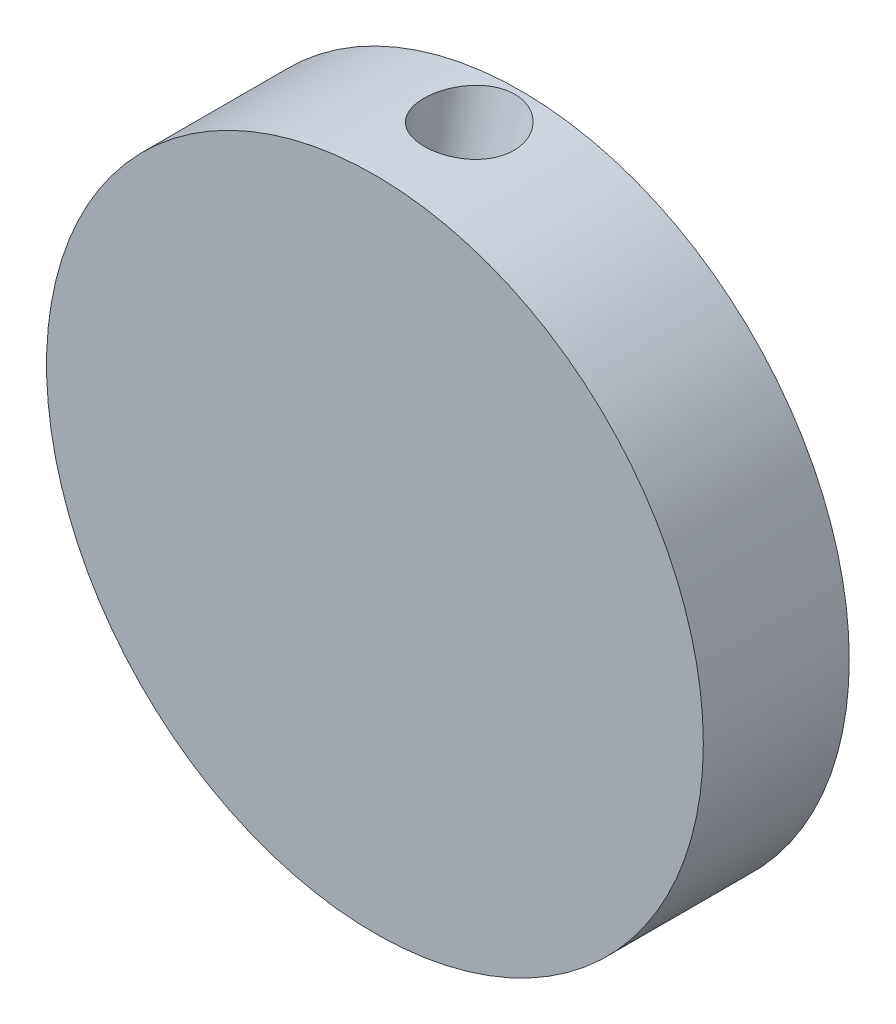
ISO-10303-21;
HEADER;
FILE_DESCRIPTION(('STEP AP214'),'2;1');
FILE_NAME('part.step','',(''),(''),'','','');
FILE_SCHEMA(('AUTOMOTIVE_DESIGN { 1 0 10303 214 1 1 1 1 }'));
ENDSEC;
DATA;
#1=APPLICATION_CONTEXT('core data for automotive mechanical design processes');
#2=APPLICATION_PROTOCOL_DEFINITION('international standard','automotive_design',2000,#1);
#3=PRODUCT_CONTEXT('',#1,'mechanical');
#4=PRODUCT('Part','Part','',(#3));
#5=PRODUCT_RELATED_PRODUCT_CATEGORY('part','',(#4));
#6=PRODUCT_DEFINITION_FORMATION('','',#4);
#7=PRODUCT_DEFINITION_CONTEXT('part definition',#1,'design');
#8=PRODUCT_DEFINITION('design','',#6,#7);
#9=PRODUCT_DEFINITION_SHAPE('','',#8);
#10=(LENGTH_UNIT() NAMED_UNIT(*) SI_UNIT(.MILLI.,.METRE.));
#11=(NAMED_UNIT(*) PLANE_ANGLE_UNIT() SI_UNIT($,.RADIAN.));
#12=(NAMED_UNIT(*) SI_UNIT($,.STERADIAN.) SOLID_ANGLE_UNIT());
#13=UNCERTAINTY_MEASURE_WITH_UNIT(LENGTH_MEASURE(1.E-05),#10,'distance_accuracy_value','');
#14=(GEOMETRIC_REPRESENTATION_CONTEXT(3) GLOBAL_UNCERTAINTY_ASSIGNED_CONTEXT((#13)) GLOBAL_UNIT_ASSIGNED_CONTEXT((#10,
#11,#12)) REPRESENTATION_CONTEXT('',''));
#15=CARTESIAN_POINT('',(0.,0.,0.));
#16=DIRECTION('',(0.,0.,1.));
#17=DIRECTION('',(1.,0.,0.));
#18=AXIS2_PLACEMENT_3D('',#15,#16,#17);
#19=CARTESIAN_POINT('',(0.,0.,10.));
#20=DIRECTION('',(0.,0.,-1.));
#21=DIRECTION('',(-1.,0.,0.));
#22=AXIS2_PLACEMENT_3D('',#19,#20,#21);
#23=CYLINDRICAL_SURFACE('',#22,22.5);
#24=CARTESIAN_POINT('',(0.,22.5,0.416088975917614));
#25=CARTESIAN_POINT('',(0.0841173534757251,22.4999998236408,0.416069373883097));
#26=CARTESIAN_POINT('',(0.168250403935408,22.4995269574923,0.419576395565012));
#27=CARTESIAN_POINT('',(0.335892927208812,22.4976489483546,0.433747976487415));
#28=CARTESIAN_POINT('',(0.41940239608743,22.4962437994874,0.444412580857198));
#29=CARTESIAN_POINT('',(0.585263971612885,22.4925397525901,0.472708884604191));
#30=CARTESIAN_POINT('',(0.667615425723561,22.4902403700504,0.49034436099223));
#31=CARTESIAN_POINT('',(0.830581807909579,22.4848127714845,0.532391950800592));
#32=CARTESIAN_POINT('',(0.911195312437828,22.481683901984,0.556809407827975));
#33=CARTESIAN_POINT('',(1.14916261741757,22.471192123422,0.639971683350821));
#34=CARTESIAN_POINT('',(1.30314417083689,22.4627120874331,0.708712052339517));
#35=CARTESIAN_POINT('',(1.52395528332059,22.4484536469346,0.829660770069476));
#36=CARTESIAN_POINT('',(1.59590955614474,22.4434406200461,0.872984514710498));
#37=CARTESIAN_POINT('',(1.7360224807668,22.433036836622,0.965338480811951));
#38=CARTESIAN_POINT('',(1.80418270484854,22.427646238678,1.01436631202975));
#39=CARTESIAN_POINT('',(1.93817059273906,22.4164703819955,1.11914849402003));
#40=CARTESIAN_POINT('',(2.00388081772991,22.4106783190496,1.17505189691424));
#41=CARTESIAN_POINT('',(2.13042663785238,22.3990025754371,1.29200082982599));
#42=CARTESIAN_POINT('',(2.19126690501274,22.3931189892077,1.35304131333654));
#43=CARTESIAN_POINT('',(2.30782451876798,22.3814069868085,1.47990090905115));
#44=CARTESIAN_POINT('',(2.36353888965143,22.375578604425,1.54572275777642));
#45=CARTESIAN_POINT('',(2.46944373986877,22.3641384141694,1.68171226044359));
#46=CARTESIAN_POINT('',(2.51963287150526,22.3585266593522,1.75188096816284));
#47=CARTESIAN_POINT('',(2.61578294788,22.347485318574,1.89851832602634));
#48=CARTESIAN_POINT('',(2.66154272965127,22.3420683682515,1.97511993584274));
#49=CARTESIAN_POINT('',(2.74651389151972,22.3317821887278,2.13190844041299));
#50=CARTESIAN_POINT('',(2.78572504883223,22.3269129781626,2.21209545702504));
#51=CARTESIAN_POINT('',(2.85740890384119,22.317851991614,2.37547088661675));
#52=CARTESIAN_POINT('',(2.88988121847792,22.3136602541436,2.45865946990077));
#53=CARTESIAN_POINT('',(2.94768165063293,22.3060983708093,2.62752346510672));
#54=CARTESIAN_POINT('',(2.97300996551459,22.3027282022486,2.71319880825617));
#55=CARTESIAN_POINT('',(3.01632042907481,22.2969121712319,2.88669308312712));
#56=CARTESIAN_POINT('',(3.03427977787933,22.2944691792206,2.97451779000094));
#57=CARTESIAN_POINT('',(3.06283189960551,22.290564511382,3.15138001031185));
#58=CARTESIAN_POINT('',(3.07342448458031,22.2891028605913,3.24041755463275));
#59=CARTESIAN_POINT('',(3.08690915830405,22.2872394016679,3.41908831134402));
#60=CARTESIAN_POINT('',(3.08980177248981,22.2868375212176,3.50872148267105));
#61=CARTESIAN_POINT('',(3.08771156595304,22.2871271773976,3.68789015432109));
#62=CARTESIAN_POINT('',(3.08272898180906,22.2878186811815,3.77742565749729));
#63=CARTESIAN_POINT('',(3.06529783318462,22.2902226210104,3.95346889260691));
#64=CARTESIAN_POINT('',(3.05304073549612,22.2919088685474,4.03999603493683));
#65=CARTESIAN_POINT('',(3.02119640677341,22.2962469930656,4.21166883956521));
#66=CARTESIAN_POINT('',(3.00160930401738,22.2988988531482,4.29681452601253));
#67=CARTESIAN_POINT('',(2.95519686657107,22.3050971603117,4.46506475175706));
#68=CARTESIAN_POINT('',(2.92837254421778,22.3086434822714,4.54816957475629));
#69=CARTESIAN_POINT('',(2.86762773591547,22.3165330524241,4.71170427229007));
#70=CARTESIAN_POINT('',(2.83370734191158,22.3208762902912,4.79213418146831));
#71=CARTESIAN_POINT('',(2.7599469305696,22.330115106485,4.94784170470627));
#72=CARTESIAN_POINT('',(2.72026781092576,22.3349949986375,5.02319652370994));
#73=CARTESIAN_POINT('',(2.63468295117825,22.3452523410879,5.17024694335402));
#74=CARTESIAN_POINT('',(2.58877707926776,22.3506298019174,5.24194246649087));
#75=CARTESIAN_POINT('',(2.49109077906407,22.3617280265248,5.38119257457418));
#76=CARTESIAN_POINT('',(2.43931051445542,22.3674487807351,5.44874727482013));
#77=CARTESIAN_POINT('',(2.33023344566767,22.3790756699144,5.57918537117096));
#78=CARTESIAN_POINT('',(2.27293659642817,22.3849818063975,5.64206872911208));
#79=CARTESIAN_POINT('',(2.09380758365651,22.4026843938392,5.82278225763448));
#80=CARTESIAN_POINT('',(1.96431935470521,22.4145144872273,5.9332679711586));
#81=CARTESIAN_POINT('',(1.75782133417142,22.431336723951,6.08154490047223));
#82=CARTESIAN_POINT('',(1.68690919907636,22.4367925989176,6.12807919192254));
#83=CARTESIAN_POINT('',(1.54146992359311,22.4472532107022,6.21522443600208));
#84=CARTESIAN_POINT('',(1.46694273124088,22.4522579410324,6.25583530345239));
#85=CARTESIAN_POINT('',(1.31348732134309,22.4617622586879,6.33147023432567));
#86=CARTESIAN_POINT('',(1.23450567197887,22.4662517567526,6.36638701336955));
#87=CARTESIAN_POINT('',(1.07386271713154,22.4745029696648,6.42949707474147));
#88=CARTESIAN_POINT('',(0.992201357747526,22.4782646698625,6.45769022173285));
#89=CARTESIAN_POINT('',(0.826819041889698,22.4849554637773,6.50733914853247));
#90=CARTESIAN_POINT('',(0.743097935278166,22.4878844966035,6.52879443563078));
#91=CARTESIAN_POINT('',(0.574151812911303,22.4928319616868,6.56476767131367));
#92=CARTESIAN_POINT('',(0.488926859350612,22.4948504315108,6.5792859061001));
#93=CARTESIAN_POINT('',(0.316368385468406,22.4979434465125,6.60138400625009));
#94=CARTESIAN_POINT('',(0.229022004019927,22.4990045532807,6.60886515278025));
#95=CARTESIAN_POINT('',(0.0540040978437779,22.5001053959806,6.61665864243248));
#96=CARTESIAN_POINT('',(-0.0336674330588507,22.5001451124146,6.61697084870374));
#97=CARTESIAN_POINT('',(-0.208740475835562,22.4992019762441,6.61032674931561));
#98=CARTESIAN_POINT('',(-0.296141965701673,22.4982190423907,6.60336986613128));
#99=CARTESIAN_POINT('',(-0.470038824138699,22.4952578959089,6.58218026674731));
#100=CARTESIAN_POINT('',(-0.556534190496044,22.4932796808497,6.56794753277772));
#101=CARTESIAN_POINT('',(-0.728762297301127,22.4883611677718,6.53227077015143));
#102=CARTESIAN_POINT('',(-0.814482385726923,22.4854128681135,6.51076672256258));
#103=CARTESIAN_POINT('',(-0.983766689305472,22.4786427793053,6.4605942211266));
#104=CARTESIAN_POINT('',(-1.0673308924832,22.4748209853048,6.43192572749347));
#105=CARTESIAN_POINT('',(-1.23168970234693,22.4664129131196,6.36760729877411));
#106=CARTESIAN_POINT('',(-1.31248439092114,22.4618266575619,6.33195757031662));
#107=CARTESIAN_POINT('',(-1.47071750514357,22.4520218438236,6.25397686618965));
#108=CARTESIAN_POINT('',(-1.54815597980006,22.44680329488,6.21164598812193));
#109=CARTESIAN_POINT('',(-1.77321117302197,22.4305179758848,6.07567653577459));
#110=CARTESIAN_POINT('',(-1.91513104088719,22.4187371923983,5.97244966429247));
#111=CARTESIAN_POINT('',(-2.17915334328485,22.3946183545539,5.74322595050253));
#112=CARTESIAN_POINT('',(-2.30125811522429,22.3822803661442,5.61723179755545));
#113=CARTESIAN_POINT('',(-2.46555572835282,22.3645703341945,5.41517158454977));
#114=CARTESIAN_POINT('',(-2.51679388231389,22.3588485119741,5.34632569819791));
#115=CARTESIAN_POINT('',(-2.61322646184651,22.3477828895114,5.20446495767289));
#116=CARTESIAN_POINT('',(-2.65842065581954,22.3424391037587,5.13144994389581));
#117=CARTESIAN_POINT('',(-2.74240816405337,22.3322858318228,4.98180972603694));
#118=CARTESIAN_POINT('',(-2.7812021044486,22.3274762933893,4.90518487604807));
#119=CARTESIAN_POINT('',(-2.85221213582995,22.3185161807145,4.74891338908314));
#120=CARTESIAN_POINT('',(-2.88442871552541,22.3143655575197,4.66926697713623));
#121=CARTESIAN_POINT('',(-2.94159454780236,22.3069012668873,4.50844272640947));
#122=CARTESIAN_POINT('',(-2.96662629016332,22.3035781626352,4.42729469198846));
#123=CARTESIAN_POINT('',(-3.00972032736484,22.2978038911474,4.26313694242918));
#124=CARTESIAN_POINT('',(-3.02778212224171,22.2953527864624,4.18012709419225));
#125=CARTESIAN_POINT('',(-3.05708115698222,22.2913541885694,4.01289659952157));
#126=CARTESIAN_POINT('',(-3.06831854593214,22.2898066756215,3.92867597957955));
#127=CARTESIAN_POINT('',(-3.08383398874399,22.2876654284574,3.75958555916594));
#128=CARTESIAN_POINT('',(-3.08811257100269,22.2870716218243,3.67471580847592));
#129=CARTESIAN_POINT('',(-3.08959001068035,22.2868668491116,3.50454816765402));
#130=CARTESIAN_POINT('',(-3.08675815368726,22.2872601469474,3.41925001398752));
#131=CARTESIAN_POINT('',(-3.07417340669441,22.2889994797851,3.24913832992056));
#132=CARTESIAN_POINT('',(-3.06441707901525,22.2903459880109,3.16432506133416));
#133=CARTESIAN_POINT('',(-3.0381106080252,22.2939467151706,2.99576830164804));
#134=CARTESIAN_POINT('',(-3.0215596863503,22.2962010380999,2.91202493424599));
#135=CARTESIAN_POINT('',(-2.9817800629462,22.3015557648756,2.74620809318466));
#136=CARTESIAN_POINT('',(-2.95855437589648,22.3046557867274,2.66413388352392));
#137=CARTESIAN_POINT('',(-2.90479457319437,22.3117216964853,2.49971424134471));
#138=CARTESIAN_POINT('',(-2.87406194124668,22.3157107894971,2.41743467003772));
#139=CARTESIAN_POINT('',(-2.80594263267294,22.3243782341673,2.25573614346534));
#140=CARTESIAN_POINT('',(-2.76855721679517,22.3290564552022,2.17631664961838));
#141=CARTESIAN_POINT('',(-2.68742574237098,22.3389662228043,2.02086107061753));
#142=CARTESIAN_POINT('',(-2.64368147447855,22.344197613486,1.94482404080776));
#143=CARTESIAN_POINT('',(-2.55007166123947,22.3550745099624,1.79654068350962));
#144=CARTESIAN_POINT('',(-2.50020002507321,22.3607204255295,1.72429823144312));
#145=CARTESIAN_POINT('',(-2.39350336904607,22.3723955897867,1.58263521757837));
#146=CARTESIAN_POINT('',(-2.33654880683995,22.3784305590968,1.5133125955912));
#147=CARTESIAN_POINT('',(-2.21696535502326,22.3905934282628,1.37975654522362));
#148=CARTESIAN_POINT('',(-2.15433637381882,22.3967213296175,1.31552319902336));
#149=CARTESIAN_POINT('',(-2.02385222230338,22.4088892571791,1.19257300846775));
#150=CARTESIAN_POINT('',(-1.95599642730393,22.4149292727794,1.13385682536965));
#151=CARTESIAN_POINT('',(-1.81547143967112,22.426748105933,1.02254170575987));
#152=CARTESIAN_POINT('',(-1.74280455708729,22.432527046631,0.969939866396271));
#153=CARTESIAN_POINT('',(-1.59383284637395,22.4436008103483,0.871618141602209));
#154=CARTESIAN_POINT('',(-1.51756574368421,22.4488994526268,0.825841666512843));
#155=CARTESIAN_POINT('',(-1.36144678643634,22.4589092981881,0.741061093240638));
#156=CARTESIAN_POINT('',(-1.28159822254519,22.4636210262798,0.702050932299319));
#157=CARTESIAN_POINT('',(-1.03738842662419,22.4766583539306,0.595851231527724));
#158=CARTESIAN_POINT('',(-0.868088224085892,22.4839073557224,0.539310073103923));
#159=CARTESIAN_POINT('',(-0.638544317417481,22.4910105822034,0.484427474420961));
#160=CARTESIAN_POINT('',(-0.581281019831593,22.4925642575797,0.472480920227587));
#161=CARTESIAN_POINT('',(-0.466134157530776,22.4952443293755,0.451994287708021));
#162=CARTESIAN_POINT('',(-0.408250779927864,22.4963708511528,0.44345320993013));
#163=CARTESIAN_POINT('',(-0.292082201896861,22.4981791934304,0.429789234112326));
#164=CARTESIAN_POINT('',(-0.233797013435646,22.4988610271172,0.424666234714505));
#165=CARTESIAN_POINT('',(-0.117010451141467,22.4997715534771,0.417822459300576));
#166=CARTESIAN_POINT('',(-0.0585090227465544,22.5000001226692,0.416102610391786));
#167=CARTESIAN_POINT('',(0.,22.5,0.416088975917614));
#168=B_SPLINE_CURVE_WITH_KNOTS('',3,(#24,#25,#26,#27,#28,#29,#30,#31,#32,#33,#34,#35,#36,#37,
#38,#39,#40,#41,#42,#43,#44,#45,#46,#47,#48,#49,#50,#51,#52,#53,#54,#55,#56,#57,#58,#59,#60,#61,
#62,#63,#64,#65,#66,#67,#68,#69,#70,#71,#72,#73,#74,#75,#76,#77,#78,#79,#80,#81,#82,#83,#84,#85,
#86,#87,#88,#89,#90,#91,#92,#93,#94,#95,#96,#97,#98,#99,#100,#101,#102,#103,#104,#105,#106,#107,
#108,#109,#110,#111,#112,#113,#114,#115,#116,#117,#118,#119,#120,#121,#122,#123,#124,#125,#126,
#127,#128,#129,#130,#131,#132,#133,#134,#135,#136,#137,#138,#139,#140,#141,#142,#143,#144,#145,
#146,#147,#148,#149,#150,#151,#152,#153,#154,#155,#156,#157,#158,#159,#160,#161,#162,#163,#164,
#165,#166,#167),.UNSPECIFIED.,.T.,.F.,(4,2,2,2,2,2,2,2,2,2,2,2,2,2,2,2,2,2,2,2,2,2,2,2,2,2,2,2,
2,2,2,2,2,2,2,2,2,2,2,2,2,2,2,2,2,2,2,2,2,2,2,2,2,2,2,2,2,2,2,2,2,2,2,2,2,2,2,2,2,2,2,4),(0.,
0.252297002620815,0.504595596015125,0.757031079549072,1.00966602714189,1.51342935818446,
1.76564399521062,2.01775332221885,2.27686785756544,2.53573075353745,2.79474299001115,
3.05381826453275,3.32168126846724,3.58955338326447,3.85744072069478,4.1253206566237,
4.39402328487617,4.66273276823683,4.931423914713,5.20010698960137,5.46201368226186,
5.72391579165874,5.98578128535612,6.24764338622308,6.50324548875808,6.75885300267914,
7.01445339608034,7.27005587744598,7.77910777743984,8.03386646766324,8.28862882095863,
8.54774304507698,8.80686248433626,9.06600086744586,9.32512855836431,9.5878394308883,
9.85055531840266,10.1132920801295,10.3760294835465,10.6409907776491,10.9059535431819,
11.170908467602,11.4358595217786,11.9607856873267,12.4856498870188,12.7434193152415,
13.0011986181032,13.2589526875383,13.5166875984223,13.7713328238392,14.0259963119061,
14.2806542363828,14.5352928232469,14.7910332432655,15.0469007154627,15.3027975070909,
15.5585789032521,15.8220409445677,16.0854531110831,16.3487912438619,16.6123932946545,
16.8818337443273,17.1512785439593,17.4207555967002,17.690104185137,17.9570778948985,
18.2238111408313,18.7562986688858,18.931796399259,19.1072425859362,19.2826835697928,
19.4581723417914),.UNSPECIFIED.);
#169=CARTESIAN_POINT('',(-3.05516703001906,22.2916117501334,4.01783290988463));
#170=VERTEX_POINT('',#169);
#171=EDGE_CURVE('E11',#170,#170,#168,.T.);
#172=ORIENTED_EDGE('',*,*,#171,.T.);
#173=EDGE_LOOP('',(#172));
#174=FACE_BOUND('',#173,.T.);
#175=CARTESIAN_POINT('',(0.,0.,10.));
#176=DIRECTION('',(0.,0.,1.));
#177=DIRECTION('',(1.,0.,0.));
#178=AXIS2_PLACEMENT_3D('',#175,#176,#177);
#179=CIRCLE('',#178,22.5);
#180=CARTESIAN_POINT('',(22.5,0.,10.));
#181=VERTEX_POINT('',#180);
#182=EDGE_CURVE('E58',#181,#181,#179,.T.);
#183=ORIENTED_EDGE('',*,*,#182,.F.);
#184=EDGE_LOOP('',(#183));
#185=FACE_BOUND('',#184,.T.);
#186=CARTESIAN_POINT('',(0.,0.,0.));
#187=DIRECTION('',(0.,0.,1.));
#188=DIRECTION('',(1.,0.,0.));
#189=AXIS2_PLACEMENT_3D('',#186,#187,#188);
#190=CIRCLE('',#189,22.5);
#191=CARTESIAN_POINT('',(22.5,0.,0.));
#192=VERTEX_POINT('',#191);
#193=EDGE_CURVE('E63',#192,#192,#190,.T.);
#194=ORIENTED_EDGE('',*,*,#193,.T.);
#195=EDGE_LOOP('',(#194));
#196=FACE_BOUND('',#195,.T.);
#197=ADVANCED_FACE('F47',(#174,#185,#196),#23,.T.);
#198=CARTESIAN_POINT('',(0.,0.,10.));
#199=DIRECTION('',(0.,0.,1.));
#200=DIRECTION('',(1.,0.,0.));
#201=AXIS2_PLACEMENT_3D('',#198,#199,#200);
#202=PLANE('',#201);
#203=ORIENTED_EDGE('',*,*,#182,.T.);
#204=EDGE_LOOP('',(#203));
#205=FACE_BOUND('',#204,.T.);
#206=ADVANCED_FACE('F94',(#205),#202,.T.);
#207=CARTESIAN_POINT('',(0.,0.,0.));
#208=DIRECTION('',(0.,0.,1.));
#209=DIRECTION('',(1.,0.,0.));
#210=AXIS2_PLACEMENT_3D('',#207,#208,#209);
#211=PLANE('',#210);
#212=ORIENTED_EDGE('',*,*,#193,.F.);
#213=EDGE_LOOP('',(#212));
#214=FACE_BOUND('',#213,.T.);
#215=ADVANCED_FACE('F98',(#214),#211,.F.);
#216=CARTESIAN_POINT('',(-3.06274251913024,22.5,3.99518260603619));
#217=CARTESIAN_POINT('',(-2.48109827644172,6.5,5.73426751992625));
#218=CARTESIAN_POINT('',(-3.10267373268623,22.5,3.73995406277534));
#219=CARTESIAN_POINT('',(-2.37295256254151,6.5,5.52750933022277));
#220=CARTESIAN_POINT('',(-3.11680813060024,22.5,3.44638389907026));
#221=CARTESIAN_POINT('',(-2.22547633510965,6.5,5.30677498484046));
#222=CARTESIAN_POINT('',(-3.03199526122605,22.5,2.79051153727545));
#223=CARTESIAN_POINT('',(-1.81149315824905,6.5,4.87616490554887));
#224=CARTESIAN_POINT('',(-2.93160620108604,22.5,2.42672868241132));
#225=CARTESIAN_POINT('',(-1.54314385697948,6.5,4.66598886489797));
#226=CARTESIAN_POINT('',(-2.6407450288179,22.5,1.87918893182986));
#227=CARTESIAN_POINT('',(-1.03777229311807,6.5,4.42474296868359));
#228=CARTESIAN_POINT('',(-2.52044875969111,22.5,1.69704321129617));
#229=CARTESIAN_POINT('',(-0.851641146792628,6.5,4.35736251720776));
#230=CARTESIAN_POINT('',(-2.2293112914103,22.5,1.35002877833899));
#231=CARTESIAN_POINT('',(-0.45380707284518,6.5,4.26192677755944));
#232=CARTESIAN_POINT('',(-2.05836038453448,22.5,1.18528535456154));
#233=CARTESIAN_POINT('',(-0.242104145223174,6.5,4.23387148938694));
#234=CARTESIAN_POINT('',(-1.6698229793619,22.5,0.892878816216725));
#235=CARTESIAN_POINT('',(0.197097355870675,6.50000000000001,4.230341545124));
#236=CARTESIAN_POINT('',(-1.45222816042201,22.5,0.765420495600394));
#237=CARTESIAN_POINT('',(0.42356164299139,6.5,4.25471926218609));
#238=CARTESIAN_POINT('',(-0.984445001252098,22.5,0.565488338745083));
#239=CARTESIAN_POINT('',(0.870610273485226,6.5,4.36090772712777));
#240=CARTESIAN_POINT('',(-0.734403105932671,22.5,0.493196737790114));
#241=CARTESIAN_POINT('',(1.09099037709902,6.5,4.44277209638682));
#242=CARTESIAN_POINT('',(-0.223946019410964,22.5,0.413334310678144));
#243=CARTESIAN_POINT('',(1.50450675650598,6.5,4.65906352418724));
#244=CARTESIAN_POINT('',(0.0362275353006556,22.5,0.405801289220368));
#245=CARTESIAN_POINT('',(1.6974472849006,6.5,4.7933881962539));
#246=CARTESIAN_POINT('',(0.542722706476557,22.5,0.453304898802088));
#247=CARTESIAN_POINT('',(2.03965216530325,6.5,5.10002199729627));
#248=CARTESIAN_POINT('',(0.788849215926051,22.5,0.508212731303708));
#249=CARTESIAN_POINT('',(2.18884406913877,6.5,5.27213278214192));
#250=CARTESIAN_POINT('',(1.24812980912862,22.5,0.667975792092309));
#251=CARTESIAN_POINT('',(2.43645177951667,6.5,5.63490108399725));
#252=CARTESIAN_POINT('',(1.46122926582526,22.5,0.772633471195062));
#253=CARTESIAN_POINT('',(2.53415640166269,6.5,5.82479325226512));
#254=CARTESIAN_POINT('',(1.84444306215561,22.5,1.01414377826216));
#255=CARTESIAN_POINT('',(2.68267905544103,6.5,6.20600310537819));
#256=CARTESIAN_POINT('',(2.01462360026007,22.5,1.1508435965687));
#257=CARTESIAN_POINT('',(2.73349708707334,6.5,6.39732079022339));
#258=CARTESIAN_POINT('',(2.45882063258319,22.5,1.58338145210892));
#259=CARTESIAN_POINT('',(2.82358910955795,6.5,6.95002634247036));
#260=CARTESIAN_POINT('',(2.66552255569464,22.5,1.89911907082249));
#261=CARTESIAN_POINT('',(2.8040112621396,6.5,7.290323306086));
#262=CARTESIAN_POINT('',(2.94660532593921,22.5,2.49774604486343));
#263=CARTESIAN_POINT('',(2.6864366260379,6.50000000000001,7.87597108082493));
#264=CARTESIAN_POINT('',(3.02281130557426,22.5,2.7816049374317));
#265=CARTESIAN_POINT('',(2.58924399034193,6.5,8.12300646382777));
#266=CARTESIAN_POINT('',(3.10267373268623,22.5,3.29206202395341));
#267=CARTESIAN_POINT('',(2.37295256254151,6.5,8.53652284323472));
#268=CARTESIAN_POINT('',(3.11680813060024,22.5,3.58563218765849));
#269=CARTESIAN_POINT('',(2.22547633510965,6.50000000000001,8.75725718861703));
#270=CARTESIAN_POINT('',(3.03199526122605,22.5,4.2415045494533));
#271=CARTESIAN_POINT('',(1.81149315824905,6.50000000000001,9.18786726790862));
#272=CARTESIAN_POINT('',(2.93160620108605,22.5,4.60528740431742));
#273=CARTESIAN_POINT('',(1.54314385697948,6.5,9.39804330855953));
#274=CARTESIAN_POINT('',(2.64074502881791,22.5,5.15282715489888));
#275=CARTESIAN_POINT('',(1.03777229311807,6.5,9.6392892047739));
#276=CARTESIAN_POINT('',(2.52044875969112,22.5,5.33497287543257));
#277=CARTESIAN_POINT('',(0.851641146792631,6.5,9.70666965624973));
#278=CARTESIAN_POINT('',(2.22931129141031,22.5,5.68198730838976));
#279=CARTESIAN_POINT('',(0.453807072845183,6.5,9.80210539589806));
#280=CARTESIAN_POINT('',(2.05836038453449,22.5,5.84673073216721));
#281=CARTESIAN_POINT('',(0.242104145223175,6.5,9.83016068407055));
#282=CARTESIAN_POINT('',(1.6698229793619,22.5,6.13913727051202));
#283=CARTESIAN_POINT('',(-0.197097355870675,6.5,9.83369062833349));
#284=CARTESIAN_POINT('',(1.45222816042201,22.5,6.26659559112835));
#285=CARTESIAN_POINT('',(-0.42356164299139,6.5,9.8093129112714));
#286=CARTESIAN_POINT('',(0.984445001252102,22.5,6.46652774798366));
#287=CARTESIAN_POINT('',(-0.870610273485227,6.5,9.70312444632973));
#288=CARTESIAN_POINT('',(0.734403105932675,22.5,6.53881934893863));
#289=CARTESIAN_POINT('',(-1.09099037709902,6.5,9.62126007707067));
#290=CARTESIAN_POINT('',(0.223946019410969,22.5,6.6186817760506));
#291=CARTESIAN_POINT('',(-1.50450675650598,6.5,9.40496864927025));
#292=CARTESIAN_POINT('',(-0.0362275353006511,22.5,6.62621479750838));
#293=CARTESIAN_POINT('',(-1.6974472849006,6.5,9.27064397720359));
#294=CARTESIAN_POINT('',(-0.542722706476552,22.5,6.57871118792666));
#295=CARTESIAN_POINT('',(-2.03965216530325,6.5,8.96401017616123));
#296=CARTESIAN_POINT('',(-0.788849215926046,22.5,6.52380335542504));
#297=CARTESIAN_POINT('',(-2.18884406913877,6.5,8.79189939131557));
#298=CARTESIAN_POINT('',(-1.24812980912861,22.5,6.36404029463644));
#299=CARTESIAN_POINT('',(-2.43645177951667,6.50000000000001,8.42913108946025));
#300=CARTESIAN_POINT('',(-1.46122926582526,22.5,6.25938261553368));
#301=CARTESIAN_POINT('',(-2.53415640166269,6.5,8.23923892119238));
#302=CARTESIAN_POINT('',(-1.8444430621556,22.5,6.01787230846659));
#303=CARTESIAN_POINT('',(-2.68267905544103,6.5,7.85802906807931));
#304=CARTESIAN_POINT('',(-2.01462360026006,22.5,5.88117249016005));
#305=CARTESIAN_POINT('',(-2.73349708707334,6.5,7.6667113832341));
#306=CARTESIAN_POINT('',(-2.45882063258318,22.5,5.44863463461983));
#307=CARTESIAN_POINT('',(-2.82358910955794,6.5,7.11400583098713));
#308=CARTESIAN_POINT('',(-2.66552255569464,22.5,5.13289701590626));
#309=CARTESIAN_POINT('',(-2.8040112621396,6.50000000000001,6.7737088673715));
#310=CARTESIAN_POINT('',(-2.9466053259392,22.5,4.53427004186532));
#311=CARTESIAN_POINT('',(-2.6864366260379,6.50000000000001,6.18806109263256));
#312=CARTESIAN_POINT('',(-3.02281130557426,22.5,4.25041114929705));
#313=CARTESIAN_POINT('',(-2.58924399034192,6.5,5.94102570962972));
#314=CARTESIAN_POINT('',(-3.06274251913024,22.5,3.99518260603619));
#315=CARTESIAN_POINT('',(-2.48109827644172,6.5,5.73426751992625));
#316=B_SPLINE_SURFACE_WITH_KNOTS('',3,1,((#216,#217),(#218,#219),(#220,#221),(#222,#223),(#224,
#225),(#226,#227),(#228,#229),(#230,#231),(#232,#233),(#234,#235),(#236,#237),(#238,#239),(#240,
#241),(#242,#243),(#244,#245),(#246,#247),(#248,#249),(#250,#251),(#252,#253),(#254,#255),(#256,
#257),(#258,#259),(#260,#261),(#262,#263),(#264,#265),(#266,#267),(#268,#269),(#270,#271),(#272,
#273),(#274,#275),(#276,#277),(#278,#279),(#280,#281),(#282,#283),(#284,#285),(#286,#287),(#288,
#289),(#290,#291),(#292,#293),(#294,#295),(#296,#297),(#298,#299),(#300,#301),(#302,#303),(#304,
#305),(#306,#307),(#308,#309),(#310,#311),(#312,#313),(#314,#315)),.UNSPECIFIED.,.T.,.F.,.F.,(4,
2,2,2,2,2,2,2,2,2,2,2,2,2,2,2,2,2,2,2,2,2,2,2,4),(2,2),(0.,0.0625,0.125,0.15625,0.1875,0.21875,
0.25,0.28125,0.3125,0.34375,0.375,0.4375,0.5,0.5625,0.625,0.65625,0.6875,0.71875,0.75,0.78125,
0.8125,0.84375,0.875,0.9375,1.),(0.,1.),.UNSPECIFIED.);
#317=CARTESIAN_POINT('',(0.,6.5,7.03201608672875));
#318=DIRECTION('',(0.,1.,0.));
#319=DIRECTION('',(0.,0.,1.));
#320=AXIS2_PLACEMENT_3D('',#317,#318,#319);
#321=CIRCLE('',#320,2.8);
#322=CARTESIAN_POINT('',(-2.48109827644172,6.5,5.73426751992625));
#323=VERTEX_POINT('',#322);
#324=EDGE_CURVE('E69',#323,#323,#321,.T.);
#325=CARTESIAN_POINT('',(-2.48109827644172,6.5,5.73426751992625));
#326=CARTESIAN_POINT('',(-2.48707815929148,6.66449595573056,5.71638799273831));
#327=CARTESIAN_POINT('',(-2.49305804214124,6.82899191146111,5.69850846555038));
#328=CARTESIAN_POINT('',(-2.50501780784077,7.15798382292223,5.66274941117451));
#329=CARTESIAN_POINT('',(-2.51099769069054,7.32247977865278,5.64486988398658));
#330=CARTESIAN_POINT('',(-2.52295745639006,7.65147169011389,5.60911082961071));
#331=CARTESIAN_POINT('',(-2.52893733923983,7.81596764584445,5.59123130242278));
#332=CARTESIAN_POINT('',(-2.54089710493936,8.14495955730556,5.55547224804691));
#333=CARTESIAN_POINT('',(-2.54687698778912,8.30945551303612,5.53759272085898));
#334=CARTESIAN_POINT('',(-2.55883675348865,8.63844742449723,5.50183366648311));
#335=CARTESIAN_POINT('',(-2.56481663633841,8.80294338022778,5.48395413929518));
#336=CARTESIAN_POINT('',(-2.57677640203794,9.1319352916889,5.44819508491931));
#337=CARTESIAN_POINT('',(-2.5827562848877,9.29643124741945,5.43031555773138));
#338=CARTESIAN_POINT('',(-2.59471605058723,9.62542315888057,5.39455650335551));
#339=CARTESIAN_POINT('',(-2.600695933437,9.78991911461112,5.37667697616758));
#340=CARTESIAN_POINT('',(-2.61265569913652,10.1189110260722,5.34091792179171));
#341=CARTESIAN_POINT('',(-2.61863558198629,10.2834069818028,5.32303839460377));
#342=CARTESIAN_POINT('',(-2.63059534768582,10.6123988932639,5.28727934022791));
#343=CARTESIAN_POINT('',(-2.63657523053558,10.7768948489945,5.26939981303997));
#344=CARTESIAN_POINT('',(-2.64853499623511,11.1058867604556,5.23364075866411));
#345=CARTESIAN_POINT('',(-2.65451487908487,11.2703827161861,5.21576123147617));
#346=CARTESIAN_POINT('',(-2.6664746447844,11.5993746276472,5.18000217710031));
#347=CARTESIAN_POINT('',(-2.67245452763417,11.7638705833778,5.16212264991237));
#348=CARTESIAN_POINT('',(-2.68441429333369,12.0928624948389,5.12636359553651));
#349=CARTESIAN_POINT('',(-2.69039417618346,12.2573584505695,5.10848406834857));
#350=CARTESIAN_POINT('',(-2.70235394188299,12.5863503620306,5.07272501397271));
#351=CARTESIAN_POINT('',(-2.70833382473275,12.7508463177611,5.05484548678477));
#352=CARTESIAN_POINT('',(-2.72029359043228,13.0798382292222,5.01908643240891));
#353=CARTESIAN_POINT('',(-2.72627347328204,13.2443341849528,5.00120690522097));
#354=CARTESIAN_POINT('',(-2.73823323898157,13.5733260964139,4.9654478508451));
#355=CARTESIAN_POINT('',(-2.74421312183133,13.7378220521445,4.94756832365717));
#356=CARTESIAN_POINT('',(-2.75617288753086,14.0668139636056,4.9118092692813));
#357=CARTESIAN_POINT('',(-2.76215277038063,14.2313099193361,4.89392974209337));
#358=CARTESIAN_POINT('',(-2.77411253608015,14.5603018307972,4.8581706877175));
#359=CARTESIAN_POINT('',(-2.78009241892992,14.7247977865278,4.84029116052957));
#360=CARTESIAN_POINT('',(-2.79205218462945,15.0537896979889,4.8045321061537));
#361=CARTESIAN_POINT('',(-2.79803206747921,15.2182856537195,4.78665257896577));
#362=CARTESIAN_POINT('',(-2.80999183317874,15.5472775651806,4.7508935245899));
#363=CARTESIAN_POINT('',(-2.8159717160285,15.7117735209111,4.73301399740197));
#364=CARTESIAN_POINT('',(-2.82793148172803,16.0407654323723,4.6972549430261));
#365=CARTESIAN_POINT('',(-2.83391136457779,16.2052613881028,4.67937541583817));
#366=CARTESIAN_POINT('',(-2.84587113027732,16.5342532995639,4.6436163614623));
#367=CARTESIAN_POINT('',(-2.85185101312709,16.6987492552945,4.62573683427437));
#368=CARTESIAN_POINT('',(-2.86381077882661,17.0277411667556,4.5899777798985));
#369=CARTESIAN_POINT('',(-2.86979066167638,17.1922371224861,4.57209825271057));
#370=CARTESIAN_POINT('',(-2.88175042737591,17.5212290339473,4.5363391983347));
#371=CARTESIAN_POINT('',(-2.88773031022567,17.6857249896778,4.51845967114677));
#372=CARTESIAN_POINT('',(-2.8996900759252,18.0147169011389,4.4827006167709));
#373=CARTESIAN_POINT('',(-2.90566995877496,18.1792128568695,4.46482108958297));
#374=CARTESIAN_POINT('',(-2.91762972447449,18.5082047683306,4.4290620352071));
#375=CARTESIAN_POINT('',(-2.92360960732426,18.6727007240611,4.41118250801917));
#376=CARTESIAN_POINT('',(-2.93556937302378,19.0016926355223,4.3754234536433));
#377=CARTESIAN_POINT('',(-2.94154925587355,19.1661885912528,4.35754392645536));
#378=CARTESIAN_POINT('',(-2.95350902157307,19.4951805027139,4.3217848720795));
#379=CARTESIAN_POINT('',(-2.95948890442284,19.6596764584445,4.30390534489156));
#380=CARTESIAN_POINT('',(-2.97144867012237,19.9886683699056,4.2681462905157));
#381=CARTESIAN_POINT('',(-2.97742855297213,20.1531643256362,4.25026676332776));
#382=CARTESIAN_POINT('',(-2.98938831867166,20.4821562370973,4.2145077089519));
#383=CARTESIAN_POINT('',(-2.99536820152142,20.6466521928278,4.19662818176396));
#384=CARTESIAN_POINT('',(-3.00732796722095,20.9756441042889,4.1608691273881));
#385=CARTESIAN_POINT('',(-3.01330785007072,21.1401400600195,4.14298960020016));
#386=CARTESIAN_POINT('',(-3.02526761577024,21.4691319714806,4.1072305458243));
#387=CARTESIAN_POINT('',(-3.03124749862001,21.6336279272112,4.08935101863636));
#388=CARTESIAN_POINT('',(-3.04320726431954,21.9626198386723,4.0535919642605));
#389=CARTESIAN_POINT('',(-3.0491871471693,22.1271157944028,4.03571243707256));
#390=CARTESIAN_POINT('',(-3.05516703001906,22.2916117501334,4.01783290988463));
#391=B_SPLINE_CURVE_WITH_KNOTS('',3,(#325,#326,#327,#328,#329,#330,#331,#332,#333,#334,#335,
#336,#337,#338,#339,#340,#341,#342,#343,#344,#345,#346,#347,#348,#349,#350,#351,#352,#353,#354,
#355,#356,#357,#358,#359,#360,#361,#362,#363,#364,#365,#366,#367,#368,#369,#370,#371,#372,#373,
#374,#375,#376,#377,#378,#379,#380,#381,#382,#383,#384,#385,#386,#387,#388,#389,#390),
.UNSPECIFIED.,.F.,.F.,(4,2,2,2,2,2,2,2,2,2,2,2,2,2,2,2,2,2,2,2,2,2,2,2,2,2,2,2,2,2,2,2,4),(0.,
0.496718434817584,0.993436869635168,1.49015530445275,1.98687373927033,2.48359217408792,
2.9803106089055,3.47702904372309,3.97374747854067,4.47046591335825,4.96718434817584,
5.46390278299342,5.96062121781101,6.45733965262859,6.95405808744617,7.45077652226376,
7.94749495708134,8.44421339189892,8.9409318267165,9.43765026153409,9.93436869635167,
10.4310871311693,10.9278055659868,11.4245240008044,11.921242435622,12.4179608704396,
12.9146793052572,13.4113977400748,13.9081161748923,14.4048346097099,14.9015530445275,
15.3982714793451,15.8949899141627),.UNSPECIFIED.);
#392=EDGE_CURVE('BSEAM89',#323,#170,#391,.T.);
#393=ORIENTED_EDGE('',*,*,#324,.F.);
#394=ORIENTED_EDGE('',*,*,#171,.F.);
#395=ORIENTED_EDGE('',*,*,#392,.T.);
#396=ORIENTED_EDGE('',*,*,#392,.F.);
#397=EDGE_LOOP('',(#393,#395,#394,#396));
#398=FACE_BOUND('',#397,.T.);
#399=ADVANCED_FACE('F89',(#398),#316,.F.);
#400=CARTESIAN_POINT('',(0.,6.5,7.03201608672875));
#401=DIRECTION('',(0.,1.,0.));
#402=DIRECTION('',(0.,0.,1.));
#403=AXIS2_PLACEMENT_3D('',#400,#401,#402);
#404=PLANE('',#403);
#405=ORIENTED_EDGE('',*,*,#324,.T.);
#406=EDGE_LOOP('',(#405));
#407=FACE_BOUND('',#406,.T.);
#408=ADVANCED_FACE('F78',(#407),#404,.T.);
#409=CLOSED_SHELL('',(#197,#206,#215,#399,#408));
#410=MANIFOLD_SOLID_BREP('B2',#409);
#411=ADVANCED_BREP_SHAPE_REPRESENTATION('',(#18,#410),#14);
#412=SHAPE_DEFINITION_REPRESENTATION(#9,#411);
ENDSEC;
END-ISO-10303-21;
